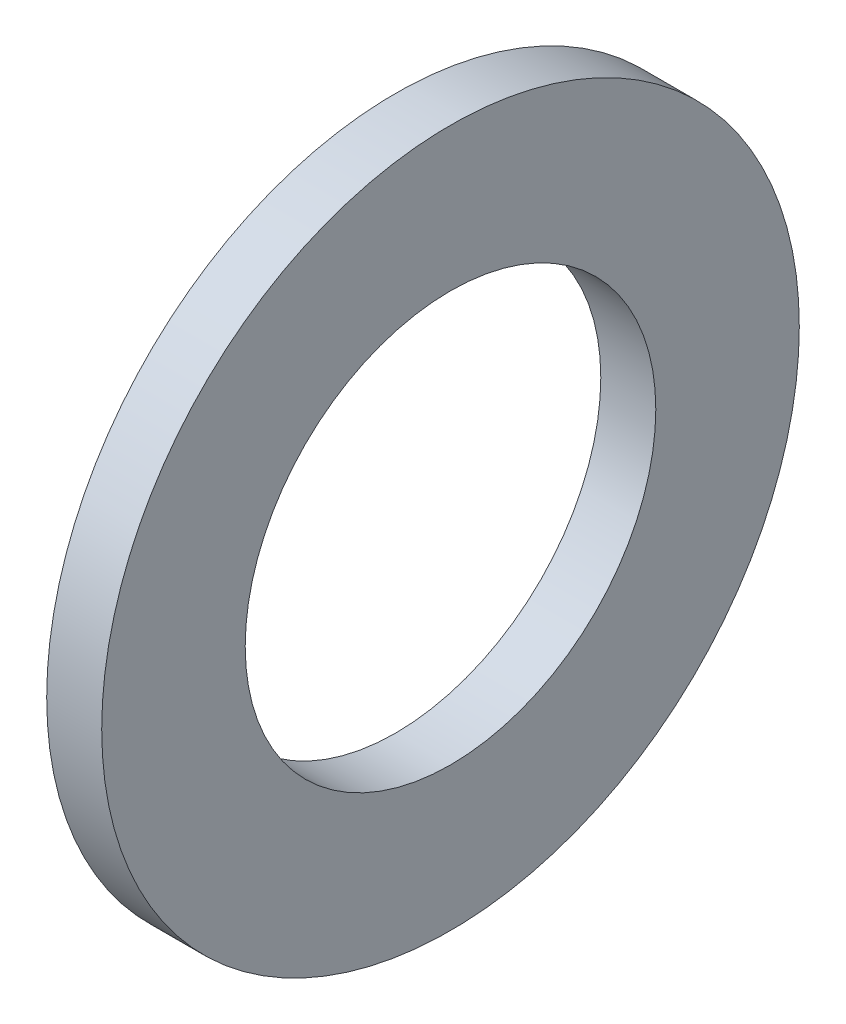
ISO-10303-21;
HEADER;
FILE_DESCRIPTION(('STEP AP214'),'2;1');
FILE_NAME('part.step','',(''),(''),'','','');
FILE_SCHEMA(('AUTOMOTIVE_DESIGN { 1 0 10303 214 1 1 1 1 }'));
ENDSEC;
DATA;
#1=APPLICATION_CONTEXT('core data for automotive mechanical design processes');
#2=APPLICATION_PROTOCOL_DEFINITION('international standard','automotive_design',2000,#1);
#3=PRODUCT_CONTEXT('',#1,'mechanical');
#4=PRODUCT('Part','Part','',(#3));
#5=PRODUCT_RELATED_PRODUCT_CATEGORY('part','',(#4));
#6=PRODUCT_DEFINITION_FORMATION('','',#4);
#7=PRODUCT_DEFINITION_CONTEXT('part definition',#1,'design');
#8=PRODUCT_DEFINITION('design','',#6,#7);
#9=PRODUCT_DEFINITION_SHAPE('','',#8);
#10=(LENGTH_UNIT() NAMED_UNIT(*) SI_UNIT(.MILLI.,.METRE.));
#11=(NAMED_UNIT(*) PLANE_ANGLE_UNIT() SI_UNIT($,.RADIAN.));
#12=(NAMED_UNIT(*) SI_UNIT($,.STERADIAN.) SOLID_ANGLE_UNIT());
#13=UNCERTAINTY_MEASURE_WITH_UNIT(LENGTH_MEASURE(1.E-05),#10,'distance_accuracy_value','');
#14=(GEOMETRIC_REPRESENTATION_CONTEXT(3) GLOBAL_UNCERTAINTY_ASSIGNED_CONTEXT((#13)) GLOBAL_UNIT_ASSIGNED_CONTEXT((#10,
#11,#12)) REPRESENTATION_CONTEXT('',''));
#15=CARTESIAN_POINT('',(0.,0.,0.));
#16=DIRECTION('',(0.,0.,1.));
#17=DIRECTION('',(1.,0.,0.));
#18=AXIS2_PLACEMENT_3D('',#15,#16,#17);
#19=CARTESIAN_POINT('',(1.7526,0.,0.));
#20=DIRECTION('',(1.,0.,0.));
#21=DIRECTION('',(0.,0.,-1.));
#22=AXIS2_PLACEMENT_3D('',#19,#20,#21);
#23=PLANE('',#22);
#24=CARTESIAN_POINT('',(1.7526,0.,0.));
#25=DIRECTION('',(1.,0.,0.));
#26=DIRECTION('',(0.,0.,-1.));
#27=AXIS2_PLACEMENT_3D('',#24,#25,#26);
#28=CIRCLE('',#27,11.1125);
#29=CARTESIAN_POINT('',(1.7526,0.,-11.1125));
#30=VERTEX_POINT('',#29);
#31=EDGE_CURVE('E10',#30,#30,#28,.T.);
#32=ORIENTED_EDGE('',*,*,#31,.T.);
#33=EDGE_LOOP('',(#32));
#34=FACE_BOUND('',#33,.T.);
#35=CARTESIAN_POINT('',(1.7526,0.,0.));
#36=DIRECTION('',(1.,0.,0.));
#37=DIRECTION('',(0.,0.,-1.));
#38=AXIS2_PLACEMENT_3D('',#35,#36,#37);
#39=CIRCLE('',#38,6.5405);
#40=CARTESIAN_POINT('',(1.7526,0.,-6.5405));
#41=VERTEX_POINT('',#40);
#42=EDGE_CURVE('E40',#41,#41,#39,.T.);
#43=ORIENTED_EDGE('',*,*,#42,.F.);
#44=EDGE_LOOP('',(#43));
#45=FACE_BOUND('',#44,.T.);
#46=ADVANCED_FACE('F29',(#34,#45),#23,.T.);
#47=CARTESIAN_POINT('',(0.,0.,0.));
#48=DIRECTION('',(1.,0.,0.));
#49=DIRECTION('',(0.,0.,-1.));
#50=AXIS2_PLACEMENT_3D('',#47,#48,#49);
#51=PLANE('',#50);
#52=CARTESIAN_POINT('',(0.,0.,0.));
#53=DIRECTION('',(1.,0.,0.));
#54=DIRECTION('',(0.,0.,-1.));
#55=AXIS2_PLACEMENT_3D('',#52,#53,#54);
#56=CIRCLE('',#55,11.1125);
#57=CARTESIAN_POINT('',(0.,0.,-11.1125));
#58=VERTEX_POINT('',#57);
#59=EDGE_CURVE('E33',#58,#58,#56,.T.);
#60=ORIENTED_EDGE('',*,*,#59,.F.);
#61=EDGE_LOOP('',(#60));
#62=FACE_BOUND('',#61,.T.);
#63=CARTESIAN_POINT('',(0.,0.,0.));
#64=DIRECTION('',(1.,0.,0.));
#65=DIRECTION('',(0.,0.,-1.));
#66=AXIS2_PLACEMENT_3D('',#63,#64,#65);
#67=CIRCLE('',#66,6.5405);
#68=CARTESIAN_POINT('',(0.,0.,-6.5405));
#69=VERTEX_POINT('',#68);
#70=EDGE_CURVE('E42',#69,#69,#67,.T.);
#71=ORIENTED_EDGE('',*,*,#70,.T.);
#72=EDGE_LOOP('',(#71));
#73=FACE_BOUND('',#72,.T.);
#74=ADVANCED_FACE('F52',(#62,#73),#51,.F.);
#75=CARTESIAN_POINT('',(1.7526,0.,0.));
#76=DIRECTION('',(-1.,0.,0.));
#77=DIRECTION('',(0.,0.,1.));
#78=AXIS2_PLACEMENT_3D('',#75,#76,#77);
#79=CYLINDRICAL_SURFACE('',#78,11.1125);
#80=ORIENTED_EDGE('',*,*,#31,.F.);
#81=EDGE_LOOP('',(#80));
#82=FACE_BOUND('',#81,.T.);
#83=ORIENTED_EDGE('',*,*,#59,.T.);
#84=EDGE_LOOP('',(#83));
#85=FACE_BOUND('',#84,.T.);
#86=ADVANCED_FACE('F31',(#82,#85),#79,.T.);
#87=CARTESIAN_POINT('',(1.7526,0.,0.));
#88=DIRECTION('',(-1.,0.,0.));
#89=DIRECTION('',(0.,0.,1.));
#90=AXIS2_PLACEMENT_3D('',#87,#88,#89);
#91=CYLINDRICAL_SURFACE('',#90,6.5405);
#92=ORIENTED_EDGE('',*,*,#42,.T.);
#93=EDGE_LOOP('',(#92));
#94=FACE_BOUND('',#93,.T.);
#95=ORIENTED_EDGE('',*,*,#70,.F.);
#96=EDGE_LOOP('',(#95));
#97=FACE_BOUND('',#96,.T.);
#98=ADVANCED_FACE('F48',(#94,#97),#91,.F.);
#99=CLOSED_SHELL('',(#46,#74,#86,#98));
#100=MANIFOLD_SOLID_BREP('B2',#99);
#101=ADVANCED_BREP_SHAPE_REPRESENTATION('',(#18,#100),#14);
#102=SHAPE_DEFINITION_REPRESENTATION(#9,#101);
ENDSEC;
END-ISO-10303-21;
